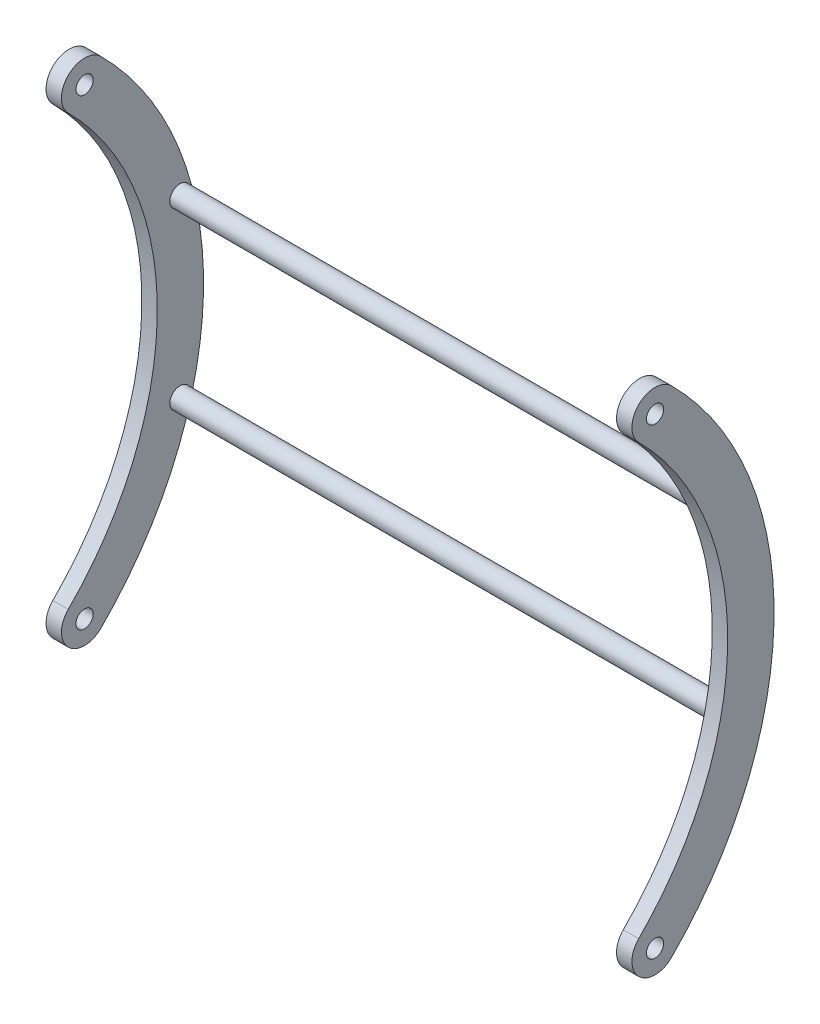
ISO-10303-21;
HEADER;
FILE_DESCRIPTION(('STEP AP214'),'2;1');
FILE_NAME('part.step','',(''),(''),'','','');
FILE_SCHEMA(('AUTOMOTIVE_DESIGN { 1 0 10303 214 1 1 1 1 }'));
ENDSEC;
DATA;
#1=APPLICATION_CONTEXT('core data for automotive mechanical design processes');
#2=APPLICATION_PROTOCOL_DEFINITION('international standard','automotive_design',2000,#1);
#3=PRODUCT_CONTEXT('',#1,'mechanical');
#4=PRODUCT('Part','Part','',(#3));
#5=PRODUCT_RELATED_PRODUCT_CATEGORY('part','',(#4));
#6=PRODUCT_DEFINITION_FORMATION('','',#4);
#7=PRODUCT_DEFINITION_CONTEXT('part definition',#1,'design');
#8=PRODUCT_DEFINITION('design','',#6,#7);
#9=PRODUCT_DEFINITION_SHAPE('','',#8);
#10=(LENGTH_UNIT() NAMED_UNIT(*) SI_UNIT(.MILLI.,.METRE.));
#11=(NAMED_UNIT(*) PLANE_ANGLE_UNIT() SI_UNIT($,.RADIAN.));
#12=(NAMED_UNIT(*) SI_UNIT($,.STERADIAN.) SOLID_ANGLE_UNIT());
#13=UNCERTAINTY_MEASURE_WITH_UNIT(LENGTH_MEASURE(1.E-05),#10,'distance_accuracy_value','');
#14=(GEOMETRIC_REPRESENTATION_CONTEXT(3) GLOBAL_UNCERTAINTY_ASSIGNED_CONTEXT((#13)) GLOBAL_UNIT_ASSIGNED_CONTEXT((#10,
#11,#12)) REPRESENTATION_CONTEXT('',''));
#15=CARTESIAN_POINT('',(0.,0.,0.));
#16=DIRECTION('',(0.,0.,1.));
#17=DIRECTION('',(1.,0.,0.));
#18=AXIS2_PLACEMENT_3D('',#15,#16,#17);
#19=CARTESIAN_POINT('',(3.,-43.8805560433848,12.4526084738196));
#20=DIRECTION('',(-1.,0.,0.));
#21=DIRECTION('',(0.,0.,1.));
#22=AXIS2_PLACEMENT_3D('',#19,#20,#21);
#23=CYLINDRICAL_SURFACE('',#22,4.4999999999996);
#24=CARTESIAN_POINT('',(0.,-43.8805560433848,12.4526084738196));
#25=DIRECTION('',(1.,0.,0.));
#26=DIRECTION('',(0.,0.,-1.));
#27=AXIS2_PLACEMENT_3D('',#24,#25,#26);
#28=CIRCLE('',#27,4.4999999999996);
#29=CARTESIAN_POINT('',(0.,-40.6985754621801,15.6345889232935));
#30=VERTEX_POINT('',#29);
#31=CARTESIAN_POINT('',(0.,-47.0650294098276,9.27312276408385));
#32=VERTEX_POINT('',#31);
#33=EDGE_CURVE('E148',#30,#32,#28,.T.);
#34=ORIENTED_EDGE('',*,*,#33,.T.);
#35=DIRECTION('',(-1.,0.,0.));
#36=VECTOR('',#35,1.);
#37=CARTESIAN_POINT('',(3.,-47.0650294098276,9.27312276408385));
#38=LINE('',#37,#36);
#39=CARTESIAN_POINT('',(3.,-47.0650294098276,9.27312276408385));
#40=VERTEX_POINT('',#39);
#41=EDGE_CURVE('E178',#40,#32,#38,.T.);
#42=ORIENTED_EDGE('',*,*,#41,.F.);
#43=CARTESIAN_POINT('',(3.,-43.8805560433848,12.4526084738196));
#44=DIRECTION('',(1.,0.,0.));
#45=DIRECTION('',(0.,0.,-1.));
#46=AXIS2_PLACEMENT_3D('',#43,#44,#45);
#47=CIRCLE('',#46,4.4999999999996);
#48=CARTESIAN_POINT('',(3.,-40.6985754621801,15.6345889232935));
#49=VERTEX_POINT('',#48);
#50=EDGE_CURVE('E78',#49,#40,#47,.T.);
#51=ORIENTED_EDGE('',*,*,#50,.F.);
#52=DIRECTION('',(-1.,0.,0.));
#53=VECTOR('',#52,1.);
#54=CARTESIAN_POINT('',(3.,-40.6985754621801,15.6345889232935));
#55=LINE('',#54,#53);
#56=EDGE_CURVE('E51',#49,#30,#55,.T.);
#57=ORIENTED_EDGE('',*,*,#56,.T.);
#58=EDGE_LOOP('',(#34,#42,#51,#57));
#59=FACE_BOUND('',#58,.T.);
#60=ADVANCED_FACE('F35',(#59),#23,.T.);
#61=CARTESIAN_POINT('',(3.,1.1194444217017,57.3821280372593));
#62=DIRECTION('',(-1.,0.,0.));
#63=DIRECTION('',(0.,0.,1.));
#64=AXIS2_PLACEMENT_3D('',#61,#62,#63);
#65=CYLINDRICAL_SURFACE('',#64,68.0897929707218);
#66=CARTESIAN_POINT('',(0.,1.1194444217017,57.3821280372593));
#67=DIRECTION('',(-1.,0.,0.));
#68=DIRECTION('',(0.,0.,1.));
#69=AXIS2_PLACEMENT_3D('',#66,#67,#68);
#70=CIRCLE('',#69,68.0897929707218);
#71=CARTESIAN_POINT('',(0.,49.303917257399,9.27312176668954));
#72=VERTEX_POINT('',#71);
#73=EDGE_CURVE('E167',#72,#32,#70,.T.);
#74=ORIENTED_EDGE('',*,*,#73,.F.);
#75=DIRECTION('',(-1.,0.,0.));
#76=VECTOR('',#75,1.);
#77=CARTESIAN_POINT('',(3.,49.303917257399,9.27312176668954));
#78=LINE('',#77,#76);
#79=CARTESIAN_POINT('',(3.,49.303917257399,9.27312176668954));
#80=VERTEX_POINT('',#79);
#81=EDGE_CURVE('E176',#80,#72,#78,.T.);
#82=ORIENTED_EDGE('',*,*,#81,.F.);
#83=CARTESIAN_POINT('',(3.,1.1194444217017,57.3821280372593));
#84=DIRECTION('',(-1.,0.,0.));
#85=DIRECTION('',(0.,0.,1.));
#86=AXIS2_PLACEMENT_3D('',#83,#84,#85);
#87=CIRCLE('',#86,68.0897929707218);
#88=EDGE_CURVE('E158',#80,#40,#87,.T.);
#89=ORIENTED_EDGE('',*,*,#88,.T.);
#90=ORIENTED_EDGE('',*,*,#41,.T.);
#91=EDGE_LOOP('',(#74,#82,#89,#90));
#92=FACE_BOUND('',#91,.T.);
#93=ADVANCED_FACE('F207',(#92),#65,.T.);
#94=CARTESIAN_POINT('',(3.,46.1194439567698,12.4526075423425));
#95=DIRECTION('',(-1.,0.,0.));
#96=DIRECTION('',(0.,0.,1.));
#97=AXIS2_PLACEMENT_3D('',#94,#95,#96);
#98=CYLINDRICAL_SURFACE('',#97,4.49999999999998);
#99=CARTESIAN_POINT('',(0.,46.1194439567698,12.4526075423425));
#100=DIRECTION('',(1.,0.,0.));
#101=DIRECTION('',(0.,0.,-1.));
#102=AXIS2_PLACEMENT_3D('',#99,#100,#101);
#103=CIRCLE('',#102,4.49999999999998);
#104=CARTESIAN_POINT('',(0.,42.9374634414304,15.6345880576818));
#105=VERTEX_POINT('',#104);
#106=EDGE_CURVE('E170',#72,#105,#103,.T.);
#107=ORIENTED_EDGE('',*,*,#106,.T.);
#108=DIRECTION('',(-1.,0.,0.));
#109=VECTOR('',#108,1.);
#110=CARTESIAN_POINT('',(3.,42.9374634414304,15.6345880576818));
#111=LINE('',#110,#109);
#112=CARTESIAN_POINT('',(3.,42.9374634414304,15.6345880576818));
#113=VERTEX_POINT('',#112);
#114=EDGE_CURVE('E67',#113,#105,#111,.T.);
#115=ORIENTED_EDGE('',*,*,#114,.F.);
#116=CARTESIAN_POINT('',(3.,46.1194439567698,12.4526075423425));
#117=DIRECTION('',(1.,0.,0.));
#118=DIRECTION('',(0.,0.,-1.));
#119=AXIS2_PLACEMENT_3D('',#116,#117,#118);
#120=CIRCLE('',#119,4.49999999999998);
#121=EDGE_CURVE('E162',#80,#113,#120,.T.);
#122=ORIENTED_EDGE('',*,*,#121,.F.);
#123=ORIENTED_EDGE('',*,*,#81,.T.);
#124=EDGE_LOOP('',(#107,#115,#122,#123));
#125=FACE_BOUND('',#124,.T.);
#126=ADVANCED_FACE('F199',(#125),#98,.T.);
#127=CARTESIAN_POINT('',(3.,1.11944442243097,57.4526070766806));
#128=DIRECTION('',(-1.,0.,0.));
#129=DIRECTION('',(0.,0.,1.));
#130=AXIS2_PLACEMENT_3D('',#127,#128,#129);
#131=CYLINDRICAL_SURFACE('',#130,59.1396096482446);
#132=CARTESIAN_POINT('',(0.,1.11944442243097,57.4526070766806));
#133=DIRECTION('',(1.,0.,0.));
#134=DIRECTION('',(0.,0.,-1.));
#135=AXIS2_PLACEMENT_3D('',#132,#133,#134);
#136=CIRCLE('',#135,59.1396096482446);
#137=EDGE_CURVE('E159',#30,#105,#136,.T.);
#138=ORIENTED_EDGE('',*,*,#137,.F.);
#139=ORIENTED_EDGE('',*,*,#56,.F.);
#140=CARTESIAN_POINT('',(3.,1.11944442243097,57.4526070766806));
#141=DIRECTION('',(1.,0.,0.));
#142=DIRECTION('',(0.,0.,-1.));
#143=AXIS2_PLACEMENT_3D('',#140,#141,#142);
#144=CIRCLE('',#143,59.1396096482446);
#145=EDGE_CURVE('E164',#49,#113,#144,.T.);
#146=ORIENTED_EDGE('',*,*,#145,.T.);
#147=ORIENTED_EDGE('',*,*,#114,.T.);
#148=EDGE_LOOP('',(#138,#139,#146,#147));
#149=FACE_BOUND('',#148,.T.);
#150=ADVANCED_FACE('F197',(#149),#131,.F.);
#151=CARTESIAN_POINT('',(3.,-21.3805558108416,34.9173682555395));
#152=DIRECTION('',(1.,0.,0.));
#153=DIRECTION('',(0.,0.,-1.));
#154=AXIS2_PLACEMENT_3D('',#151,#152,#153);
#155=PLANE('',#154);
#156=CARTESIAN_POINT('',(3.,46.1206903494147,12.4538549121857));
#157=DIRECTION('',(1.,0.,0.));
#158=DIRECTION('',(0.,0.,-1.));
#159=AXIS2_PLACEMENT_3D('',#156,#157,#158);
#160=CIRCLE('',#159,1.68);
#161=CARTESIAN_POINT('',(3.,46.1206903494147,10.7738549121857));
#162=VERTEX_POINT('',#161);
#163=EDGE_CURVE('E149',#162,#162,#160,.T.);
#164=ORIENTED_EDGE('',*,*,#163,.F.);
#165=EDGE_LOOP('',(#164));
#166=FACE_BOUND('',#165,.T.);
#167=CARTESIAN_POINT('',(3.,-43.8818024360039,12.4538558436887));
#168=DIRECTION('',(1.,0.,0.));
#169=DIRECTION('',(0.,0.,-1.));
#170=AXIS2_PLACEMENT_3D('',#167,#168,#169);
#171=CIRCLE('',#170,1.68);
#172=CARTESIAN_POINT('',(3.,-43.8818024360039,10.7738558436887));
#173=VERTEX_POINT('',#172);
#174=EDGE_CURVE('E144',#173,#173,#171,.T.);
#175=ORIENTED_EDGE('',*,*,#174,.F.);
#176=EDGE_LOOP('',(#175));
#177=FACE_BOUND('',#176,.T.);
#178=ORIENTED_EDGE('',*,*,#50,.T.);
#179=ORIENTED_EDGE('',*,*,#88,.F.);
#180=ORIENTED_EDGE('',*,*,#121,.T.);
#181=ORIENTED_EDGE('',*,*,#145,.F.);
#182=EDGE_LOOP('',(#178,#179,#180,#181));
#183=FACE_BOUND('',#182,.T.);
#184=ADVANCED_FACE('F188',(#166,#177,#183),#155,.T.);
#185=CARTESIAN_POINT('',(0.,-21.3805558108416,34.9173682555395));
#186=DIRECTION('',(1.,0.,0.));
#187=DIRECTION('',(0.,0.,-1.));
#188=AXIS2_PLACEMENT_3D('',#185,#186,#187);
#189=PLANE('',#188);
#190=CARTESIAN_POINT('',(0.,-15.8750578480108,-6.11858743431803));
#191=DIRECTION('',(1.,0.,0.));
#192=DIRECTION('',(0.,0.,-1.));
#193=AXIS2_PLACEMENT_3D('',#190,#191,#192);
#194=CIRCLE('',#193,2.);
#195=CARTESIAN_POINT('',(0.,-15.8750578480108,-8.11858743431803));
#196=VERTEX_POINT('',#195);
#197=EDGE_CURVE('E11',#196,#196,#194,.F.);
#198=ORIENTED_EDGE('',*,*,#197,.F.);
#199=EDGE_LOOP('',(#198));
#200=FACE_BOUND('',#199,.T.);
#201=CARTESIAN_POINT('',(0.,18.1578470348644,-6.11858743431803));
#202=DIRECTION('',(1.,0.,0.));
#203=DIRECTION('',(0.,0.,-1.));
#204=AXIS2_PLACEMENT_3D('',#201,#202,#203);
#205=CIRCLE('',#204,2.);
#206=CARTESIAN_POINT('',(0.,18.1578470348644,-8.11858743431804));
#207=VERTEX_POINT('',#206);
#208=EDGE_CURVE('E43',#207,#207,#205,.F.);
#209=ORIENTED_EDGE('',*,*,#208,.F.);
#210=EDGE_LOOP('',(#209));
#211=FACE_BOUND('',#210,.T.);
#212=CARTESIAN_POINT('',(0.,46.1206903494147,12.4538549121857));
#213=DIRECTION('',(1.,0.,0.));
#214=DIRECTION('',(0.,0.,-1.));
#215=AXIS2_PLACEMENT_3D('',#212,#213,#214);
#216=CIRCLE('',#215,1.68);
#217=CARTESIAN_POINT('',(0.,46.1206903494147,10.7738549121857));
#218=VERTEX_POINT('',#217);
#219=EDGE_CURVE('E145',#218,#218,#216,.T.);
#220=ORIENTED_EDGE('',*,*,#219,.T.);
#221=EDGE_LOOP('',(#220));
#222=FACE_BOUND('',#221,.T.);
#223=CARTESIAN_POINT('',(0.,-43.8818024360039,12.4538558436887));
#224=DIRECTION('',(1.,0.,0.));
#225=DIRECTION('',(0.,0.,-1.));
#226=AXIS2_PLACEMENT_3D('',#223,#224,#225);
#227=CIRCLE('',#226,1.68);
#228=CARTESIAN_POINT('',(0.,-43.8818024360039,10.7738558436887));
#229=VERTEX_POINT('',#228);
#230=EDGE_CURVE('E152',#229,#229,#227,.T.);
#231=ORIENTED_EDGE('',*,*,#230,.T.);
#232=EDGE_LOOP('',(#231));
#233=FACE_BOUND('',#232,.T.);
#234=ORIENTED_EDGE('',*,*,#33,.F.);
#235=ORIENTED_EDGE('',*,*,#137,.T.);
#236=ORIENTED_EDGE('',*,*,#106,.F.);
#237=ORIENTED_EDGE('',*,*,#73,.T.);
#238=EDGE_LOOP('',(#234,#235,#236,#237));
#239=FACE_BOUND('',#238,.T.);
#240=ADVANCED_FACE('F184',(#200,#211,#222,#233,#239),#189,.F.);
#241=CARTESIAN_POINT('',(0.,-43.8818024360039,12.4538558436887));
#242=DIRECTION('',(1.,0.,0.));
#243=DIRECTION('',(0.,0.,-1.));
#244=AXIS2_PLACEMENT_3D('',#241,#242,#243);
#245=CYLINDRICAL_SURFACE('',#244,1.68);
#246=ORIENTED_EDGE('',*,*,#230,.F.);
#247=EDGE_LOOP('',(#246));
#248=FACE_BOUND('',#247,.T.);
#249=ORIENTED_EDGE('',*,*,#174,.T.);
#250=EDGE_LOOP('',(#249));
#251=FACE_BOUND('',#250,.T.);
#252=ADVANCED_FACE('F187',(#248,#251),#245,.F.);
#253=CARTESIAN_POINT('',(0.,46.1206903494147,12.4538549121857));
#254=DIRECTION('',(1.,0.,0.));
#255=DIRECTION('',(0.,0.,-1.));
#256=AXIS2_PLACEMENT_3D('',#253,#254,#255);
#257=CYLINDRICAL_SURFACE('',#256,1.68);
#258=ORIENTED_EDGE('',*,*,#219,.F.);
#259=EDGE_LOOP('',(#258));
#260=FACE_BOUND('',#259,.T.);
#261=ORIENTED_EDGE('',*,*,#163,.T.);
#262=EDGE_LOOP('',(#261));
#263=FACE_BOUND('',#262,.T.);
#264=ADVANCED_FACE('F242',(#260,#263),#257,.F.);
#265=CARTESIAN_POINT('',(-108.,18.1578470348644,-6.11858743431803));
#266=DIRECTION('',(1.,0.,0.));
#267=DIRECTION('',(0.,0.,-1.));
#268=AXIS2_PLACEMENT_3D('',#265,#266,#267);
#269=CYLINDRICAL_SURFACE('',#268,2.);
#270=CARTESIAN_POINT('',(-108.,18.1578470348644,-6.11858743431803));
#271=DIRECTION('',(-1.,0.,0.));
#272=DIRECTION('',(0.,0.,1.));
#273=AXIS2_PLACEMENT_3D('',#270,#271,#272);
#274=CIRCLE('',#273,2.);
#275=CARTESIAN_POINT('',(-108.,18.1578470348644,-4.11858743431803));
#276=VERTEX_POINT('',#275);
#277=EDGE_CURVE('E136',#276,#276,#274,.T.);
#278=ORIENTED_EDGE('',*,*,#277,.F.);
#279=EDGE_LOOP('',(#278));
#280=FACE_BOUND('',#279,.T.);
#281=ORIENTED_EDGE('',*,*,#208,.T.);
#282=EDGE_LOOP('',(#281));
#283=FACE_BOUND('',#282,.T.);
#284=ADVANCED_FACE('F182',(#280,#283),#269,.T.);
#285=CARTESIAN_POINT('',(-108.,-15.8750578480108,-6.11858743431803));
#286=DIRECTION('',(1.,0.,0.));
#287=DIRECTION('',(0.,0.,-1.));
#288=AXIS2_PLACEMENT_3D('',#285,#286,#287);
#289=CYLINDRICAL_SURFACE('',#288,2.);
#290=CARTESIAN_POINT('',(-108.,-15.8750578480108,-6.11858743431803));
#291=DIRECTION('',(-1.,0.,0.));
#292=DIRECTION('',(0.,0.,1.));
#293=AXIS2_PLACEMENT_3D('',#290,#291,#292);
#294=CIRCLE('',#293,2.);
#295=CARTESIAN_POINT('',(-108.,-15.8750578480108,-4.11858743431803));
#296=VERTEX_POINT('',#295);
#297=EDGE_CURVE('E133',#296,#296,#294,.T.);
#298=ORIENTED_EDGE('',*,*,#297,.F.);
#299=EDGE_LOOP('',(#298));
#300=FACE_BOUND('',#299,.T.);
#301=ORIENTED_EDGE('',*,*,#197,.T.);
#302=EDGE_LOOP('',(#301));
#303=FACE_BOUND('',#302,.T.);
#304=ADVANCED_FACE('F266',(#300,#303),#289,.T.);
#305=CARTESIAN_POINT('',(-111.,-21.3811790069559,34.9368511943263));
#306=DIRECTION('',(-1.,0.,0.));
#307=DIRECTION('',(0.,0.,1.));
#308=AXIS2_PLACEMENT_3D('',#305,#306,#307);
#309=PLANE('',#308);
#310=CARTESIAN_POINT('',(-111.,46.1206903494147,12.4538549121857));
#311=DIRECTION('',(-1.,0.,0.));
#312=DIRECTION('',(0.,0.,1.));
#313=AXIS2_PLACEMENT_3D('',#310,#311,#312);
#314=CIRCLE('',#313,1.68);
#315=CARTESIAN_POINT('',(-111.,46.1206903494147,14.1338549121857));
#316=VERTEX_POINT('',#315);
#317=EDGE_CURVE('E367',#316,#316,#314,.T.);
#318=ORIENTED_EDGE('',*,*,#317,.F.);
#319=EDGE_LOOP('',(#318));
#320=FACE_BOUND('',#319,.T.);
#321=CARTESIAN_POINT('',(-111.,1.11944442209216,57.419846544964));
#322=DIRECTION('',(-1.,0.,0.));
#323=DIRECTION('',(0.,0.,1.));
#324=AXIS2_PLACEMENT_3D('',#321,#322,#323);
#325=CIRCLE('',#324,68.1164483020902);
#326=CARTESIAN_POINT('',(-111.,49.303917257399,9.27312176668954));
#327=VERTEX_POINT('',#326);
#328=CARTESIAN_POINT('',(-111.,-47.0650294098276,9.27312276408385));
#329=VERTEX_POINT('',#328);
#330=EDGE_CURVE('E118',#327,#329,#325,.T.);
#331=ORIENTED_EDGE('',*,*,#330,.T.);
#332=CARTESIAN_POINT('',(-111.,-43.8818024360039,12.4538558436887));
#333=DIRECTION('',(-1.,0.,0.));
#334=DIRECTION('',(0.,0.,1.));
#335=AXIS2_PLACEMENT_3D('',#332,#333,#334);
#336=CIRCLE('',#335,4.49999965450793);
#337=CARTESIAN_POINT('',(-111.,-40.6985754621802,15.6345889232935));
#338=VERTEX_POINT('',#337);
#339=EDGE_CURVE('E107',#329,#338,#336,.T.);
#340=ORIENTED_EDGE('',*,*,#339,.T.);
#341=CARTESIAN_POINT('',(-111.,1.11944442209193,57.4198465449647));
#342=DIRECTION('',(1.,0.,0.));
#343=DIRECTION('',(0.,0.,-1.));
#344=AXIS2_PLACEMENT_3D('',#341,#342,#343);
#345=CIRCLE('',#344,59.1164489930747);
#346=CARTESIAN_POINT('',(-111.,42.9374634414304,15.6345880576818));
#347=VERTEX_POINT('',#346);
#348=EDGE_CURVE('E117',#338,#347,#345,.T.);
#349=ORIENTED_EDGE('',*,*,#348,.T.);
#350=CARTESIAN_POINT('',(-111.,46.1206903494147,12.4538549121857));
#351=DIRECTION('',(-1.,0.,0.));
#352=DIRECTION('',(0.,0.,-1.));
#353=AXIS2_PLACEMENT_3D('',#350,#351,#352);
#354=CIRCLE('',#353,4.49999965450811);
#355=EDGE_CURVE('E124',#347,#327,#354,.T.);
#356=ORIENTED_EDGE('',*,*,#355,.T.);
#357=EDGE_LOOP('',(#331,#340,#349,#356));
#358=FACE_BOUND('',#357,.T.);
#359=CARTESIAN_POINT('',(-111.,-43.8818024360039,12.4538558436887));
#360=DIRECTION('',(-1.,0.,0.));
#361=DIRECTION('',(0.,0.,1.));
#362=AXIS2_PLACEMENT_3D('',#359,#360,#361);
#363=CIRCLE('',#362,1.68);
#364=CARTESIAN_POINT('',(-111.,-43.8818024360039,14.1338558436887));
#365=VERTEX_POINT('',#364);
#366=EDGE_CURVE('E358',#365,#365,#363,.T.);
#367=ORIENTED_EDGE('',*,*,#366,.F.);
#368=EDGE_LOOP('',(#367));
#369=FACE_BOUND('',#368,.T.);
#370=ADVANCED_FACE('F121',(#320,#358,#369),#309,.T.);
#371=CARTESIAN_POINT('',(-108.,-21.3811790069559,34.9368511943263));
#372=DIRECTION('',(-1.,0.,0.));
#373=DIRECTION('',(0.,0.,1.));
#374=AXIS2_PLACEMENT_3D('',#371,#372,#373);
#375=PLANE('',#374);
#376=ORIENTED_EDGE('',*,*,#277,.T.);
#377=EDGE_LOOP('',(#376));
#378=FACE_BOUND('',#377,.T.);
#379=ORIENTED_EDGE('',*,*,#297,.T.);
#380=EDGE_LOOP('',(#379));
#381=FACE_BOUND('',#380,.T.);
#382=CARTESIAN_POINT('',(-108.,1.11944442209216,57.419846544964));
#383=DIRECTION('',(-1.,0.,0.));
#384=DIRECTION('',(0.,0.,1.));
#385=AXIS2_PLACEMENT_3D('',#382,#383,#384);
#386=CIRCLE('',#385,68.1164483020902);
#387=CARTESIAN_POINT('',(-108.,49.303917257399,9.27312176668954));
#388=VERTEX_POINT('',#387);
#389=CARTESIAN_POINT('',(-108.,-47.0650294098276,9.27312276408385));
#390=VERTEX_POINT('',#389);
#391=EDGE_CURVE('E132',#388,#390,#386,.T.);
#392=ORIENTED_EDGE('',*,*,#391,.F.);
#393=CARTESIAN_POINT('',(-108.,46.1206903494147,12.4538549121857));
#394=DIRECTION('',(-1.,0.,0.));
#395=DIRECTION('',(0.,0.,-1.));
#396=AXIS2_PLACEMENT_3D('',#393,#394,#395);
#397=CIRCLE('',#396,4.49999965450811);
#398=CARTESIAN_POINT('',(-108.,42.9374634414304,15.6345880576818));
#399=VERTEX_POINT('',#398);
#400=EDGE_CURVE('E128',#399,#388,#397,.T.);
#401=ORIENTED_EDGE('',*,*,#400,.F.);
#402=CARTESIAN_POINT('',(-108.,1.11944442209193,57.4198465449647));
#403=DIRECTION('',(1.,0.,0.));
#404=DIRECTION('',(0.,0.,-1.));
#405=AXIS2_PLACEMENT_3D('',#402,#403,#404);
#406=CIRCLE('',#405,59.1164489930747);
#407=CARTESIAN_POINT('',(-108.,-40.6985754621802,15.6345889232935));
#408=VERTEX_POINT('',#407);
#409=EDGE_CURVE('E378',#408,#399,#406,.T.);
#410=ORIENTED_EDGE('',*,*,#409,.F.);
#411=CARTESIAN_POINT('',(-108.,-43.8818024360039,12.4538558436887));
#412=DIRECTION('',(-1.,0.,0.));
#413=DIRECTION('',(0.,0.,1.));
#414=AXIS2_PLACEMENT_3D('',#411,#412,#413);
#415=CIRCLE('',#414,4.49999965450793);
#416=EDGE_CURVE('E376',#390,#408,#415,.T.);
#417=ORIENTED_EDGE('',*,*,#416,.F.);
#418=EDGE_LOOP('',(#392,#401,#410,#417));
#419=FACE_BOUND('',#418,.T.);
#420=CARTESIAN_POINT('',(-108.,46.1206903494147,12.4538549121857));
#421=DIRECTION('',(-1.,0.,0.));
#422=DIRECTION('',(0.,0.,1.));
#423=AXIS2_PLACEMENT_3D('',#420,#421,#422);
#424=CIRCLE('',#423,1.68);
#425=CARTESIAN_POINT('',(-108.,46.1206903494147,14.1338549121857));
#426=VERTEX_POINT('',#425);
#427=EDGE_CURVE('E364',#426,#426,#424,.T.);
#428=ORIENTED_EDGE('',*,*,#427,.T.);
#429=EDGE_LOOP('',(#428));
#430=FACE_BOUND('',#429,.T.);
#431=CARTESIAN_POINT('',(-108.,-43.8818024360039,12.4538558436887));
#432=DIRECTION('',(-1.,0.,0.));
#433=DIRECTION('',(0.,0.,1.));
#434=AXIS2_PLACEMENT_3D('',#431,#432,#433);
#435=CIRCLE('',#434,1.68);
#436=CARTESIAN_POINT('',(-108.,-43.8818024360039,14.1338558436887));
#437=VERTEX_POINT('',#436);
#438=EDGE_CURVE('E361',#437,#437,#435,.T.);
#439=ORIENTED_EDGE('',*,*,#438,.T.);
#440=EDGE_LOOP('',(#439));
#441=FACE_BOUND('',#440,.T.);
#442=ADVANCED_FACE('F285',(#378,#381,#419,#430,#441),#375,.F.);
#443=CARTESIAN_POINT('',(-111.,1.11944442209216,57.419846544964));
#444=DIRECTION('',(1.,0.,0.));
#445=DIRECTION('',(0.,0.,-1.));
#446=AXIS2_PLACEMENT_3D('',#443,#444,#445);
#447=CYLINDRICAL_SURFACE('',#446,68.1164483020902);
#448=ORIENTED_EDGE('',*,*,#391,.T.);
#449=DIRECTION('',(1.,0.,0.));
#450=VECTOR('',#449,1.);
#451=CARTESIAN_POINT('',(-111.,-47.0650294098276,9.27312276408385));
#452=LINE('',#451,#450);
#453=EDGE_CURVE('E111',#329,#390,#452,.T.);
#454=ORIENTED_EDGE('',*,*,#453,.F.);
#455=ORIENTED_EDGE('',*,*,#330,.F.);
#456=DIRECTION('',(1.,0.,0.));
#457=VECTOR('',#456,1.);
#458=CARTESIAN_POINT('',(-111.,49.303917257399,9.27312176668954));
#459=LINE('',#458,#457);
#460=EDGE_CURVE('E374',#327,#388,#459,.T.);
#461=ORIENTED_EDGE('',*,*,#460,.T.);
#462=EDGE_LOOP('',(#448,#454,#455,#461));
#463=FACE_BOUND('',#462,.T.);
#464=ADVANCED_FACE('F130',(#463),#447,.T.);
#465=CARTESIAN_POINT('',(-111.,-43.8818024360039,12.4538558436887));
#466=DIRECTION('',(1.,0.,0.));
#467=DIRECTION('',(0.,0.,-1.));
#468=AXIS2_PLACEMENT_3D('',#465,#466,#467);
#469=CYLINDRICAL_SURFACE('',#468,4.49999965450793);
#470=ORIENTED_EDGE('',*,*,#416,.T.);
#471=DIRECTION('',(1.,0.,0.));
#472=VECTOR('',#471,1.);
#473=CARTESIAN_POINT('',(-111.,-40.6985754621802,15.6345889232935));
#474=LINE('',#473,#472);
#475=EDGE_CURVE('E114',#338,#408,#474,.T.);
#476=ORIENTED_EDGE('',*,*,#475,.F.);
#477=ORIENTED_EDGE('',*,*,#339,.F.);
#478=ORIENTED_EDGE('',*,*,#453,.T.);
#479=EDGE_LOOP('',(#470,#476,#477,#478));
#480=FACE_BOUND('',#479,.T.);
#481=ADVANCED_FACE('F109',(#480),#469,.T.);
#482=CARTESIAN_POINT('',(-111.,1.11944442209193,57.4198465449647));
#483=DIRECTION('',(1.,0.,0.));
#484=DIRECTION('',(0.,0.,-1.));
#485=AXIS2_PLACEMENT_3D('',#482,#483,#484);
#486=CYLINDRICAL_SURFACE('',#485,59.1164489930747);
#487=ORIENTED_EDGE('',*,*,#409,.T.);
#488=DIRECTION('',(1.,0.,0.));
#489=VECTOR('',#488,1.);
#490=CARTESIAN_POINT('',(-111.,42.9374634414304,15.6345880576818));
#491=LINE('',#490,#489);
#492=EDGE_CURVE('E138',#347,#399,#491,.T.);
#493=ORIENTED_EDGE('',*,*,#492,.F.);
#494=ORIENTED_EDGE('',*,*,#348,.F.);
#495=ORIENTED_EDGE('',*,*,#475,.T.);
#496=EDGE_LOOP('',(#487,#493,#494,#495));
#497=FACE_BOUND('',#496,.T.);
#498=ADVANCED_FACE('F312',(#497),#486,.F.);
#499=CARTESIAN_POINT('',(-111.,46.1206903494147,12.4538549121857));
#500=DIRECTION('',(1.,0.,0.));
#501=DIRECTION('',(0.,0.,-1.));
#502=AXIS2_PLACEMENT_3D('',#499,#500,#501);
#503=CYLINDRICAL_SURFACE('',#502,4.49999965450811);
#504=ORIENTED_EDGE('',*,*,#400,.T.);
#505=ORIENTED_EDGE('',*,*,#460,.F.);
#506=ORIENTED_EDGE('',*,*,#355,.F.);
#507=ORIENTED_EDGE('',*,*,#492,.T.);
#508=EDGE_LOOP('',(#504,#505,#506,#507));
#509=FACE_BOUND('',#508,.T.);
#510=ADVANCED_FACE('F321',(#509),#503,.T.);
#511=CARTESIAN_POINT('',(-111.,46.1206903494147,12.4538549121857));
#512=DIRECTION('',(1.,0.,0.));
#513=DIRECTION('',(0.,0.,-1.));
#514=AXIS2_PLACEMENT_3D('',#511,#512,#513);
#515=CYLINDRICAL_SURFACE('',#514,1.68);
#516=ORIENTED_EDGE('',*,*,#317,.T.);
#517=EDGE_LOOP('',(#516));
#518=FACE_BOUND('',#517,.T.);
#519=ORIENTED_EDGE('',*,*,#427,.F.);
#520=EDGE_LOOP('',(#519));
#521=FACE_BOUND('',#520,.T.);
#522=ADVANCED_FACE('F331',(#518,#521),#515,.F.);
#523=CARTESIAN_POINT('',(-111.,-43.8818024360039,12.4538558436887));
#524=DIRECTION('',(1.,0.,0.));
#525=DIRECTION('',(0.,0.,-1.));
#526=AXIS2_PLACEMENT_3D('',#523,#524,#525);
#527=CYLINDRICAL_SURFACE('',#526,1.68);
#528=ORIENTED_EDGE('',*,*,#366,.T.);
#529=EDGE_LOOP('',(#528));
#530=FACE_BOUND('',#529,.T.);
#531=ORIENTED_EDGE('',*,*,#438,.F.);
#532=EDGE_LOOP('',(#531));
#533=FACE_BOUND('',#532,.T.);
#534=ADVANCED_FACE('F341',(#530,#533),#527,.F.);
#535=CLOSED_SHELL('',(#60,#93,#126,#150,#184,#240,#252,#264,#284,#304,#370,#442,#464,#481,#498,
#510,#522,#534));
#536=MANIFOLD_SOLID_BREP('B2',#535);
#537=ADVANCED_BREP_SHAPE_REPRESENTATION('',(#18,#536),#14);
#538=SHAPE_DEFINITION_REPRESENTATION(#9,#537);
ENDSEC;
END-ISO-10303-21;
